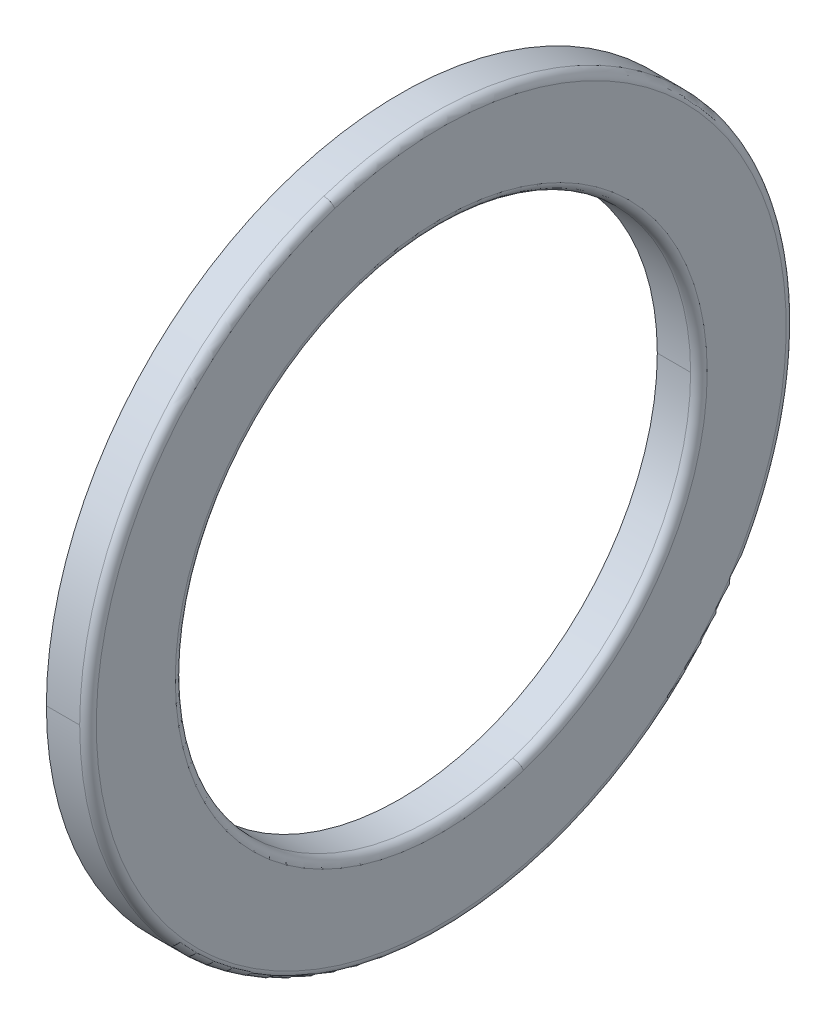
ISO-10303-21;
HEADER;
FILE_DESCRIPTION(('STEP AP214'),'2;1');
FILE_NAME('part.step','',(''),(''),'','','');
FILE_SCHEMA(('AUTOMOTIVE_DESIGN { 1 0 10303 214 1 1 1 1 }'));
ENDSEC;
DATA;
#1=APPLICATION_CONTEXT('core data for automotive mechanical design processes');
#2=APPLICATION_PROTOCOL_DEFINITION('international standard','automotive_design',2000,#1);
#3=PRODUCT_CONTEXT('',#1,'mechanical');
#4=PRODUCT('Part','Part','',(#3));
#5=PRODUCT_RELATED_PRODUCT_CATEGORY('part','',(#4));
#6=PRODUCT_DEFINITION_FORMATION('','',#4);
#7=PRODUCT_DEFINITION_CONTEXT('part definition',#1,'design');
#8=PRODUCT_DEFINITION('design','',#6,#7);
#9=PRODUCT_DEFINITION_SHAPE('','',#8);
#10=(LENGTH_UNIT() NAMED_UNIT(*) SI_UNIT(.MILLI.,.METRE.));
#11=(NAMED_UNIT(*) PLANE_ANGLE_UNIT() SI_UNIT($,.RADIAN.));
#12=(NAMED_UNIT(*) SI_UNIT($,.STERADIAN.) SOLID_ANGLE_UNIT());
#13=UNCERTAINTY_MEASURE_WITH_UNIT(LENGTH_MEASURE(1.E-05),#10,'distance_accuracy_value','');
#14=(GEOMETRIC_REPRESENTATION_CONTEXT(3) GLOBAL_UNCERTAINTY_ASSIGNED_CONTEXT((#13)) GLOBAL_UNIT_ASSIGNED_CONTEXT((#10,
#11,#12)) REPRESENTATION_CONTEXT('',''));
#15=CARTESIAN_POINT('',(0.,0.,0.));
#16=DIRECTION('',(0.,0.,1.));
#17=DIRECTION('',(1.,0.,0.));
#18=AXIS2_PLACEMENT_3D('',#15,#16,#17);
#19=CARTESIAN_POINT('',(8.5,0.,0.));
#20=DIRECTION('',(1.,0.,0.));
#21=DIRECTION('',(0.,-0.309016994374947,0.951056516295154));
#22=AXIS2_PLACEMENT_3D('',#19,#20,#21);
#23=TOROIDAL_SURFACE('',#22,36.25,4.3655);
#24=CARTESIAN_POINT('',(8.5,-34.4757987156993,-11.2018660460918));
#25=DIRECTION('',(0.,0.309016994374947,-0.951056516295154));
#26=DIRECTION('',(0.800000000000001,0.570633909777091,0.185410196624968));
#27=AXIS2_PLACEMENT_3D('',#24,#25,#26);
#28=CIRCLE('',#27,4.3655);
#29=CARTESIAN_POINT('',(11.9924,-31.9846963825674,-10.3924578327255));
#30=VERTEX_POINT('',#29);
#31=CARTESIAN_POINT('',(11.9924,-36.9669010488312,-12.0112742594581));
#32=VERTEX_POINT('',#31);
#33=EDGE_CURVE('E11',#30,#32,#28,.T.);
#34=ORIENTED_EDGE('',*,*,#33,.F.);
#35=CARTESIAN_POINT('',(11.9924,0.,0.));
#36=DIRECTION('',(1.,0.,0.));
#37=DIRECTION('',(0.,-0.951056516295154,-0.309016994374947));
#38=AXIS2_PLACEMENT_3D('',#35,#36,#37);
#39=CIRCLE('',#38,33.6307);
#40=CARTESIAN_POINT('',(11.9924,31.9846963825674,10.3924578327255));
#41=VERTEX_POINT('',#40);
#42=EDGE_CURVE('E25',#30,#41,#39,.T.);
#43=ORIENTED_EDGE('',*,*,#42,.T.);
#44=CARTESIAN_POINT('',(8.5,34.4757987156993,11.2018660460918));
#45=DIRECTION('',(0.,-0.309016994374947,0.951056516295154));
#46=DIRECTION('',(0.8,-0.570633909777093,-0.185410196624968));
#47=AXIS2_PLACEMENT_3D('',#44,#45,#46);
#48=CIRCLE('',#47,4.3655);
#49=CARTESIAN_POINT('',(11.9924,36.9669010488312,12.0112742594581));
#50=VERTEX_POINT('',#49);
#51=EDGE_CURVE('E327',#41,#50,#48,.T.);
#52=ORIENTED_EDGE('',*,*,#51,.T.);
#53=CARTESIAN_POINT('',(11.9924,0.,0.));
#54=DIRECTION('',(1.,0.,0.));
#55=DIRECTION('',(0.,-0.951056516295154,-0.309016994374947));
#56=AXIS2_PLACEMENT_3D('',#53,#54,#55);
#57=CIRCLE('',#56,38.8693);
#58=EDGE_CURVE('E323',#32,#50,#57,.T.);
#59=ORIENTED_EDGE('',*,*,#58,.F.);
#60=EDGE_LOOP('',(#34,#43,#52,#59));
#61=FACE_BOUND('',#60,.T.);
#62=ADVANCED_FACE('F17',(#61),#23,.F.);
#63=CARTESIAN_POINT('',(11.9924,42.5,0.));
#64=DIRECTION('',(-1.,0.,0.));
#65=DIRECTION('',(0.,0.,1.));
#66=AXIS2_PLACEMENT_3D('',#63,#64,#65);
#67=PLANE('',#66);
#68=ORIENTED_EDGE('',*,*,#58,.T.);
#69=CARTESIAN_POINT('',(11.9924,0.,0.));
#70=DIRECTION('',(1.,0.,0.));
#71=DIRECTION('',(0.,0.,-1.));
#72=AXIS2_PLACEMENT_3D('',#69,#70,#71);
#73=CIRCLE('',#72,38.8693);
#74=EDGE_CURVE('E318',#50,#32,#73,.T.);
#75=ORIENTED_EDGE('',*,*,#74,.T.);
#76=EDGE_LOOP('',(#68,#75));
#77=FACE_BOUND('',#76,.T.);
#78=CARTESIAN_POINT('',(11.9924,0.,0.));
#79=DIRECTION('',(1.,0.,0.));
#80=DIRECTION('',(0.,0.,-1.));
#81=AXIS2_PLACEMENT_3D('',#78,#79,#80);
#82=CIRCLE('',#81,42.5);
#83=CARTESIAN_POINT('',(11.9924,0.,42.5));
#84=VERTEX_POINT('',#83);
#85=CARTESIAN_POINT('',(11.9924,0.,-42.5));
#86=VERTEX_POINT('',#85);
#87=EDGE_CURVE('E313',#84,#86,#82,.T.);
#88=ORIENTED_EDGE('',*,*,#87,.F.);
#89=CARTESIAN_POINT('',(11.9924,0.,0.));
#90=DIRECTION('',(1.,0.,0.));
#91=DIRECTION('',(0.,0.,-1.));
#92=AXIS2_PLACEMENT_3D('',#89,#90,#91);
#93=CIRCLE('',#92,42.5);
#94=EDGE_CURVE('E308',#86,#84,#93,.T.);
#95=ORIENTED_EDGE('',*,*,#94,.F.);
#96=EDGE_LOOP('',(#88,#95));
#97=FACE_BOUND('',#96,.T.);
#98=ADVANCED_FACE('F233',(#77,#97),#67,.T.);
#99=CARTESIAN_POINT('',(16.,0.,0.));
#100=DIRECTION('',(1.,0.,0.));
#101=DIRECTION('',(0.,-1.,0.));
#102=AXIS2_PLACEMENT_3D('',#99,#100,#101);
#103=CYLINDRICAL_SURFACE('',#102,42.5);
#104=DIRECTION('',(1.,0.,0.));
#105=VECTOR('',#104,1.);
#106=CARTESIAN_POINT('',(11.9924,0.,42.5));
#107=LINE('',#106,#105);
#108=CARTESIAN_POINT('',(16.,0.,42.5));
#109=VERTEX_POINT('',#108);
#110=EDGE_CURVE('E304',#84,#109,#107,.T.);
#111=ORIENTED_EDGE('',*,*,#110,.T.);
#112=CARTESIAN_POINT('',(16.,0.,0.));
#113=DIRECTION('',(1.,0.,0.));
#114=DIRECTION('',(0.,0.,-1.));
#115=AXIS2_PLACEMENT_3D('',#112,#113,#114);
#116=CIRCLE('',#115,42.5);
#117=CARTESIAN_POINT('',(16.,40.419901942544,13.1332222609353));
#118=VERTEX_POINT('',#117);
#119=EDGE_CURVE('E300',#118,#109,#116,.T.);
#120=ORIENTED_EDGE('',*,*,#119,.F.);
#121=CARTESIAN_POINT('',(16.,0.,0.));
#122=DIRECTION('',(1.,0.,0.));
#123=DIRECTION('',(0.,0.,-1.));
#124=AXIS2_PLACEMENT_3D('',#121,#122,#123);
#125=CIRCLE('',#124,42.5);
#126=CARTESIAN_POINT('',(16.,0.,-42.5));
#127=VERTEX_POINT('',#126);
#128=EDGE_CURVE('E296',#127,#118,#125,.T.);
#129=ORIENTED_EDGE('',*,*,#128,.F.);
#130=DIRECTION('',(1.,0.,0.));
#131=VECTOR('',#130,1.);
#132=CARTESIAN_POINT('',(11.9924,0.,-42.5));
#133=LINE('',#132,#131);
#134=EDGE_CURVE('E291',#86,#127,#133,.T.);
#135=ORIENTED_EDGE('',*,*,#134,.F.);
#136=ORIENTED_EDGE('',*,*,#94,.T.);
#137=EDGE_LOOP('',(#111,#120,#129,#135,#136));
#138=FACE_BOUND('',#137,.T.);
#139=ADVANCED_FACE('F237',(#138),#103,.T.);
#140=CARTESIAN_POINT('',(16.,0.,0.));
#141=DIRECTION('',(1.,0.,0.));
#142=DIRECTION('',(0.,1.,0.));
#143=AXIS2_PLACEMENT_3D('',#140,#141,#142);
#144=CYLINDRICAL_SURFACE('',#143,42.5);
#145=ORIENTED_EDGE('',*,*,#110,.F.);
#146=ORIENTED_EDGE('',*,*,#87,.T.);
#147=ORIENTED_EDGE('',*,*,#134,.T.);
#148=CARTESIAN_POINT('',(16.,0.,0.));
#149=DIRECTION('',(1.,0.,0.));
#150=DIRECTION('',(0.,0.,-1.));
#151=AXIS2_PLACEMENT_3D('',#148,#149,#150);
#152=CIRCLE('',#151,42.5);
#153=CARTESIAN_POINT('',(16.,-40.419901942544,-13.1332222609353));
#154=VERTEX_POINT('',#153);
#155=EDGE_CURVE('E287',#154,#127,#152,.T.);
#156=ORIENTED_EDGE('',*,*,#155,.F.);
#157=CARTESIAN_POINT('',(16.,0.,0.));
#158=DIRECTION('',(1.,0.,0.));
#159=DIRECTION('',(0.,0.,-1.));
#160=AXIS2_PLACEMENT_3D('',#157,#158,#159);
#161=CIRCLE('',#160,42.5);
#162=EDGE_CURVE('E266',#109,#154,#161,.T.);
#163=ORIENTED_EDGE('',*,*,#162,.F.);
#164=EDGE_LOOP('',(#145,#146,#147,#156,#163));
#165=FACE_BOUND('',#164,.T.);
#166=ADVANCED_FACE('F242',(#165),#144,.T.);
#167=CARTESIAN_POINT('',(16.0000000000016,0.,0.));
#168=DIRECTION('',(1.,0.,0.));
#169=DIRECTION('',(0.,0.309016994374947,-0.951056516295154));
#170=AXIS2_PLACEMENT_3D('',#167,#168,#169);
#171=TOROIDAL_SURFACE('',#170,41.5000000000015,0.999999999998447);
#172=CARTESIAN_POINT('',(16.0000000000016,-39.4688454262503,-12.8242052665608));
#173=DIRECTION('',(0.,0.309016994374947,-0.951056516295154));
#174=DIRECTION('',(1.,0.,0.));
#175=AXIS2_PLACEMENT_3D('',#172,#173,#174);
#176=CIRCLE('',#175,0.999999999998447);
#177=CARTESIAN_POINT('',(17.,-39.4688454262503,-12.8242052665608));
#178=VERTEX_POINT('',#177);
#179=EDGE_CURVE('E259',#178,#154,#176,.T.);
#180=ORIENTED_EDGE('',*,*,#179,.F.);
#181=CARTESIAN_POINT('',(17.,0.,0.));
#182=DIRECTION('',(1.,0.,0.));
#183=DIRECTION('',(0.,0.,-1.));
#184=AXIS2_PLACEMENT_3D('',#181,#182,#183);
#185=CIRCLE('',#184,41.5);
#186=CARTESIAN_POINT('',(17.,39.4688454262503,12.8242052665608));
#187=VERTEX_POINT('',#186);
#188=EDGE_CURVE('E262',#187,#178,#185,.T.);
#189=ORIENTED_EDGE('',*,*,#188,.F.);
#190=CARTESIAN_POINT('',(16.0000000000016,39.4688454262503,12.8242052665608));
#191=DIRECTION('',(0.,-0.309016994374947,0.951056516295154));
#192=DIRECTION('',(1.,0.,0.));
#193=AXIS2_PLACEMENT_3D('',#190,#191,#192);
#194=CIRCLE('',#193,0.999999999998447);
#195=EDGE_CURVE('E271',#187,#118,#194,.T.);
#196=ORIENTED_EDGE('',*,*,#195,.T.);
#197=ORIENTED_EDGE('',*,*,#119,.T.);
#198=ORIENTED_EDGE('',*,*,#162,.T.);
#199=EDGE_LOOP('',(#180,#189,#196,#197,#198));
#200=FACE_BOUND('',#199,.T.);
#201=ADVANCED_FACE('F249',(#200),#171,.T.);
#202=CARTESIAN_POINT('',(16.0000000000016,0.,0.));
#203=DIRECTION('',(1.,0.,0.));
#204=DIRECTION('',(0.,-0.309016994374947,0.951056516295154));
#205=AXIS2_PLACEMENT_3D('',#202,#203,#204);
#206=TOROIDAL_SURFACE('',#205,41.5000000000015,0.999999999998447);
#207=ORIENTED_EDGE('',*,*,#179,.T.);
#208=ORIENTED_EDGE('',*,*,#155,.T.);
#209=ORIENTED_EDGE('',*,*,#128,.T.);
#210=ORIENTED_EDGE('',*,*,#195,.F.);
#211=CARTESIAN_POINT('',(17.,-39.4688454262489,-12.8242052665603));
#212=CARTESIAN_POINT('',(17.,-37.4543421555393,-19.0238989990822));
#213=CARTESIAN_POINT('',(17.,-34.2230332453021,-24.828421920391));
#214=CARTESIAN_POINT('',(17.,-29.8762607858964,-29.917564290866));
#215=CARTESIAN_POINT('',(17.,-19.4215831267624,-38.1169885356923));
#216=CARTESIAN_POINT('',(17.,-6.64299591734355,-41.7555416530186));
#217=CARTESIAN_POINT('',(17.,0.0292075835215191,-42.2806668346647));
#218=CARTESIAN_POINT('',(17.,13.2196452458229,-40.6858845403664));
#219=CARTESIAN_POINT('',(17.,24.8283229910739,-34.222945789598));
#220=CARTESIAN_POINT('',(17.,29.9175881758226,-29.8762877753694));
#221=CARTESIAN_POINT('',(17.,38.1169945302978,-19.4215713616868));
#222=CARTESIAN_POINT('',(17.,41.7555057788508,-6.64299245802185));
#223=CARTESIAN_POINT('',(17.,42.2807957370094,0.0291789531958564));
#224=CARTESIAN_POINT('',(17.,41.4831665897274,6.62445236381219));
#225=CARTESIAN_POINT('',(17.,39.4688454262489,12.8242052665603));
#226=B_SPLINE_CURVE_WITH_KNOTS('',5,(#211,#212,#213,#214,#215,#216,#217,#218,#219,#220,#221,
#222,#223,#224,#225),.UNSPECIFIED.,.F.,.F.,(6,3,3,3,6),(0.,0.785398163397448,1.5707963267949,
2.35619449019234,3.14159265358979),.UNSPECIFIED.);
#227=EDGE_CURVE('E205',#178,#187,#226,.T.);
#228=ORIENTED_EDGE('',*,*,#227,.F.);
#229=EDGE_LOOP('',(#207,#208,#209,#210,#228));
#230=FACE_BOUND('',#229,.T.);
#231=ADVANCED_FACE('F167',(#230),#206,.T.);
#232=CARTESIAN_POINT('',(17.,32.,0.));
#233=DIRECTION('',(1.,0.,0.));
#234=DIRECTION('',(0.,0.,-1.));
#235=AXIS2_PLACEMENT_3D('',#232,#233,#234);
#236=PLANE('',#235);
#237=ORIENTED_EDGE('',*,*,#227,.T.);
#238=ORIENTED_EDGE('',*,*,#188,.T.);
#239=EDGE_LOOP('',(#237,#238));
#240=FACE_BOUND('',#239,.T.);
#241=CARTESIAN_POINT('',(17.,30.4338085214434,9.8885438199979));
#242=CARTESIAN_POINT('',(17.,30.2720180013902,10.3865197825287));
#243=CARTESIAN_POINT('',(17.,30.0979849505985,10.8805169119714));
#244=CARTESIAN_POINT('',(17.,29.7258986864093,11.8593807699742));
#245=CARTESIAN_POINT('',(17.,29.5278454730118,12.3442474985344));
#246=CARTESIAN_POINT('',(17.,29.108183782482,13.3036778200655));
#247=CARTESIAN_POINT('',(17.,28.8865753053498,13.7782414130365));
#248=CARTESIAN_POINT('',(17.,28.420340238244,14.7159234436322));
#249=CARTESIAN_POINT('',(17.,28.1757136482706,15.1790418812568));
#250=CARTESIAN_POINT('',(17.,27.6640308043857,16.0927175745469));
#251=CARTESIAN_POINT('',(17.,27.3969745504742,16.5432748302124));
#252=CARTESIAN_POINT('',(17.,26.8410759758741,17.4307428171146));
#253=CARTESIAN_POINT('',(17.,26.5522336551854,17.8676535483512));
#254=CARTESIAN_POINT('',(17.,25.9534587304449,18.7267759062143));
#255=CARTESIAN_POINT('',(17.,25.643526126393,19.1489875328407));
#256=CARTESIAN_POINT('',(17.,25.0033173066067,19.9776945431137));
#257=CARTESIAN_POINT('',(17.,24.6730410908722,20.3841899267604));
#258=CARTESIAN_POINT('',(17.,23.9929407075273,21.1804851663695));
#259=CARTESIAN_POINT('',(17.,23.6431165399169,21.570285022332));
#260=CARTESIAN_POINT('',(17.,22.9247630110936,22.3322501450383));
#261=CARTESIAN_POINT('',(17.,22.5562336498806,22.7044154117822));
#262=CARTESIAN_POINT('',(17.,21.8013575530379,23.4302147772024));
#263=CARTESIAN_POINT('',(17.,21.415010817408,23.7838488758788));
#264=CARTESIAN_POINT('',(17.,20.6254307149445,24.4717339696786));
#265=CARTESIAN_POINT('',(17.,20.2221973481109,24.8059849648021));
#266=CARTESIAN_POINT('',(17.,19.3998154077164,25.4542986115632));
#267=CARTESIAN_POINT('',(17.,18.9806668341555,25.7683612632008));
#268=CARTESIAN_POINT('',(17.,18.1274642459395,26.3755416185561));
#269=CARTESIAN_POINT('',(17.,17.6934102312843,26.6686593222737));
#270=CARTESIAN_POINT('',(17.,16.811442435018,27.2332436355661));
#271=CARTESIAN_POINT('',(17.,16.3635286534068,27.5047102451408));
#272=CARTESIAN_POINT('',(17.,15.4549203867615,28.0253383833074));
#273=CARTESIAN_POINT('',(17.,14.9942259017273,28.2744999118992));
#274=CARTESIAN_POINT('',(17.,14.0611660816023,28.7499176361536));
#275=CARTESIAN_POINT('',(17.,13.5888007465114,28.9761738318162));
#276=CARTESIAN_POINT('',(17.,12.6335371957397,29.405235819219));
#277=CARTESIAN_POINT('',(17.,12.1506389800589,29.6080416109592));
#278=CARTESIAN_POINT('',(17.,11.1754730122055,29.9897142136014));
#279=CARTESIAN_POINT('',(17.,10.6832052600331,30.1685810245033));
#280=CARTESIAN_POINT('',(17.,9.69048613532908,30.5019447596545));
#281=CARTESIAN_POINT('',(17.,9.19003476279757,30.6564416839037));
#282=CARTESIAN_POINT('',(17.,8.18215402856629,30.9406934491267));
#283=CARTESIAN_POINT('',(17.,7.67472466686652,31.0704482901005));
#284=CARTESIAN_POINT('',(17.,6.65411039607662,31.3049032979954));
#285=CARTESIAN_POINT('',(17.,6.14092548698649,31.4096034649165));
#286=CARTESIAN_POINT('',(17.,5.11003642881157,31.5936968928335));
#287=CARTESIAN_POINT('',(17.,4.59233227972677,31.6730901538293));
#288=CARTESIAN_POINT('',(17.,3.55365193620319,31.8063785045757));
#289=CARTESIAN_POINT('',(17.,3.0326757417644,31.8602735943264));
#290=CARTESIAN_POINT('',(17.,1.98870638481736,31.9424357645907));
#291=CARTESIAN_POINT('',(17.,1.4657132223091,31.9707028451044));
#292=CARTESIAN_POINT('',(17.,0.418969865560389,32.0015408990219));
#293=CARTESIAN_POINT('',(17.,-0.104780328680064,32.0041118724257));
#294=CARTESIAN_POINT('',(17.,-1.15177598880014,31.9835515184234));
#295=CARTESIAN_POINT('',(17.,-1.67502145467976,31.9604201910172));
#296=CARTESIAN_POINT('',(17.,-2.71974711391999,31.8885109607887));
#297=CARTESIAN_POINT('',(17.,-3.24122730728059,31.8397330579664));
#298=CARTESIAN_POINT('',(17.,-4.28116613002069,31.7166481871458));
#299=CARTESIAN_POINT('',(17.,-4.79962475940019,31.6423412191477));
#300=CARTESIAN_POINT('',(17.,-5.83227144192831,31.4683772299699));
#301=CARTESIAN_POINT('',(17.,-6.34645949507693,31.3687202087902));
#302=CARTESIAN_POINT('',(17.,-7.36932630108569,31.1442961957426));
#303=CARTESIAN_POINT('',(17.,-7.87800505394583,31.0195292038745));
#304=CARTESIAN_POINT('',(17.,-8.888627807707,30.7451858240616));
#305=CARTESIAN_POINT('',(17.,-9.39057180860802,30.5956094361167));
#306=CARTESIAN_POINT('',(17.,-10.3865158313877,30.2720076067702));
#307=CARTESIAN_POINT('',(17.,-10.8805158532663,30.0979821653685));
#308=CARTESIAN_POINT('',(17.,-11.8593818286792,29.7259014716394));
#309=CARTESIAN_POINT('',(17.,-12.3442477822135,29.527846219312));
#310=CARTESIAN_POINT('',(17.,-13.3036775363863,29.1081830361819));
#311=CARTESIAN_POINT('',(17.,-13.7782413370249,28.8865751053793));
#312=CARTESIAN_POINT('',(17.,-14.7159235196437,28.4203404382146));
#313=CARTESIAN_POINT('',(17.,-15.179041901624,28.1757137018525));
#314=CARTESIAN_POINT('',(17.,-16.0927175541796,27.6640307508038));
#315=CARTESIAN_POINT('',(17.,-16.543274824755,27.396974536117));
#316=CARTESIAN_POINT('',(17.,-17.4307428225719,26.8410759902314));
#317=CARTESIAN_POINT('',(17.,-17.8676535498135,26.5522336590324));
#318=CARTESIAN_POINT('',(17.,-18.7267759047519,25.9534587265979));
#319=CARTESIAN_POINT('',(17.,-19.1489875324489,25.6435261253623));
#320=CARTESIAN_POINT('',(17.,-19.9776945435055,25.0033173076375));
#321=CARTESIAN_POINT('',(17.,-20.3841899268653,24.6730410911485));
#322=CARTESIAN_POINT('',(17.,-21.1804851662644,23.9929407072512));
#323=CARTESIAN_POINT('',(17.,-21.5702850223038,23.6431165398429));
#324=CARTESIAN_POINT('',(17.,-22.3322501450664,22.9247630111676));
#325=CARTESIAN_POINT('',(17.,-22.7044154117897,22.5562336499005));
#326=CARTESIAN_POINT('',(17.,-23.4302147771949,21.8013575530181));
#327=CARTESIAN_POINT('',(17.,-23.7838488758767,21.4150108174027));
#328=CARTESIAN_POINT('',(17.,-24.4717339696806,20.6254307149499));
#329=CARTESIAN_POINT('',(17.,-24.8059849648026,20.2221973481124));
#330=CARTESIAN_POINT('',(17.,-25.4542986115626,19.3998154077151));
#331=CARTESIAN_POINT('',(17.,-25.7683612632006,18.9806668341552));
#332=CARTESIAN_POINT('',(17.,-26.3755416185562,18.1274642459399));
#333=CARTESIAN_POINT('',(17.,-26.6686593222737,17.6934102312844));
#334=CARTESIAN_POINT('',(17.,-27.233243635566,16.8114424350179));
#335=CARTESIAN_POINT('',(17.,-27.5047102451408,16.3635286534068));
#336=CARTESIAN_POINT('',(17.,-28.0253383833074,15.4549203867615));
#337=CARTESIAN_POINT('',(17.,-28.2744999118992,14.9942259017273));
#338=CARTESIAN_POINT('',(17.,-28.7499176361536,14.0611660816023));
#339=CARTESIAN_POINT('',(17.,-28.9761738318161,13.5888007465115));
#340=CARTESIAN_POINT('',(17.,-29.405235819219,12.6335371957398));
#341=CARTESIAN_POINT('',(17.,-29.6080416109593,12.1506389800589));
#342=CARTESIAN_POINT('',(17.,-29.9897142136012,11.1754730122056));
#343=CARTESIAN_POINT('',(17.,-30.1685810245029,10.6832052600332));
#344=CARTESIAN_POINT('',(17.,-30.5019447596548,9.69048613532902));
#345=CARTESIAN_POINT('',(17.,-30.6564416839052,9.19003476279721));
#346=CARTESIAN_POINT('',(17.,-30.9406934491253,8.18215402856672));
#347=CARTESIAN_POINT('',(17.,-31.070448290095,7.67472466686804));
#348=CARTESIAN_POINT('',(17.,-31.3049032980009,6.65411039607517));
#349=CARTESIAN_POINT('',(17.,-31.409603464937,6.14092548698098));
#350=CARTESIAN_POINT('',(17.,-31.593696892813,5.11003642881718));
#351=CARTESIAN_POINT('',(17.,-31.6730901537529,4.59233227974757));
#352=CARTESIAN_POINT('',(17.,-31.8063785046521,3.55365193618251));
#353=CARTESIAN_POINT('',(17.,-31.8602735946116,3.03267574168705));
#354=CARTESIAN_POINT('',(17.,-31.9424357643056,1.98870638489482));
#355=CARTESIAN_POINT('',(17.,-31.9707028440401,1.46571322259806));
#356=CARTESIAN_POINT('',(17.,-32.0015409000861,0.418969865271547));
#357=CARTESIAN_POINT('',(17.,-32.0041118763975,-0.104780329758194));
#358=CARTESIAN_POINT('',(17.,-31.9835515144516,-1.15177598772189));
#359=CARTESIAN_POINT('',(17.,-31.9604201761942,-1.67502145065585));
#360=CARTESIAN_POINT('',(17.,-31.8885109756117,-2.71974711794379));
#361=CARTESIAN_POINT('',(17.,-31.8397331132866,-3.24122732229777));
#362=CARTESIAN_POINT('',(17.,-31.7166481318256,-4.28116611500344));
#363=CARTESIAN_POINT('',(17.,-31.6423410126896,-4.79962470335512));
#364=CARTESIAN_POINT('',(17.,-31.4683774364279,-5.83227149797332));
#365=CARTESIAN_POINT('',(17.,-31.3687209793022,-6.34645970423985));
#366=CARTESIAN_POINT('',(17.,-31.1442954252306,-7.36932609192269));
#367=CARTESIAN_POINT('',(17.,-31.0195263282849,-7.878004273339));
#368=CARTESIAN_POINT('',(17.,-30.7451886996512,-8.88862858831373));
#369=CARTESIAN_POINT('',(17.,-30.5956201679634,-9.39057472187216));
#370=CARTESIAN_POINT('',(17.,-30.4338085214435,-9.88854381999781));
#371=B_SPLINE_CURVE_WITH_KNOTS('',3,(#241,#242,#243,#244,#245,#246,#247,#248,#249,#250,#251,
#252,#253,#254,#255,#256,#257,#258,#259,#260,#261,#262,#263,#264,#265,#266,#267,#268,#269,#270,
#271,#272,#273,#274,#275,#276,#277,#278,#279,#280,#281,#282,#283,#284,#285,#286,#287,#288,#289,
#290,#291,#292,#293,#294,#295,#296,#297,#298,#299,#300,#301,#302,#303,#304,#305,#306,#307,#308,
#309,#310,#311,#312,#313,#314,#315,#316,#317,#318,#319,#320,#321,#322,#323,#324,#325,#326,#327,
#328,#329,#330,#331,#332,#333,#334,#335,#336,#337,#338,#339,#340,#341,#342,#343,#344,#345,#346,
#347,#348,#349,#350,#351,#352,#353,#354,#355,#356,#357,#358,#359,#360,#361,#362,#363,#364,#365,
#366,#367,#368,#369,#370),.UNSPECIFIED.,.F.,.F.,(4,2,2,2,2,2,2,2,2,2,2,2,2,2,2,2,2,2,2,2,2,2,2,
2,2,2,2,2,2,2,2,2,2,2,2,2,2,2,2,2,2,2,2,2,2,2,2,2,2,2,2,2,2,2,2,2,2,2,2,2,2,2,2,2,4),(0.,
1.5706386254663,3.14127725093262,4.71191587639892,6.28255450186523,7.85319312733154,
9.42383175279786,10.9944703782642,12.5651090037305,14.1357476291968,15.7063862546631,
17.2770248801294,18.8476635055957,20.418302131062,21.9889407565283,23.5595793819946,
25.1302180074609,26.7008566329273,28.2714952583936,29.8421338838599,31.4127725093262,
32.9834111347925,34.5540497602588,36.1246883857251,37.6953270111914,39.2659656366577,
40.836604262124,42.4072428875903,43.9778815130566,45.5485201385229,47.1191587639893,
48.6897973894556,50.2604360149219,51.8310746403882,53.4017132658545,54.9723518913208,
56.5429905167871,58.1136291422534,59.6842677677197,61.254906393186,62.8255450186523,
64.3961836441186,65.966822269585,67.5374608950513,69.1080995205176,70.6787381459839,
72.2493767714502,73.8200153969165,75.3906540223828,76.9612926478491,78.5319312733154,
80.1025698987817,81.673208524248,83.2438471497143,84.8144857751806,86.3851244006469,
87.9557630261132,89.5264016515795,91.0970402770458,92.6676789025122,94.2383175279785,
95.8089561534448,97.3795947789111,98.9502334043774,100.520872029844),.UNSPECIFIED.);
#372=CARTESIAN_POINT('',(17.,30.4338085214434,9.88854381999784));
#373=VERTEX_POINT('',#372);
#374=CARTESIAN_POINT('',(17.,-30.4338085214434,-9.88854381999783));
#375=VERTEX_POINT('',#374);
#376=EDGE_CURVE('E201',#373,#375,#371,.T.);
#377=ORIENTED_EDGE('',*,*,#376,.F.);
#378=CARTESIAN_POINT('',(17.,-30.4338085214434,-9.88854381999789));
#379=CARTESIAN_POINT('',(17.,-30.2720180013902,-10.3865197825287));
#380=CARTESIAN_POINT('',(17.,-30.0979849505985,-10.8805169119714));
#381=CARTESIAN_POINT('',(17.,-29.7258986864093,-11.8593807699742));
#382=CARTESIAN_POINT('',(17.,-29.5278454730118,-12.3442474985344));
#383=CARTESIAN_POINT('',(17.,-29.108183782482,-13.3036778200655));
#384=CARTESIAN_POINT('',(17.,-28.8865753053498,-13.7782414130365));
#385=CARTESIAN_POINT('',(17.,-28.420340238244,-14.7159234436321));
#386=CARTESIAN_POINT('',(17.,-28.1757136482706,-15.1790418812568));
#387=CARTESIAN_POINT('',(17.,-27.6640308043857,-16.0927175745469));
#388=CARTESIAN_POINT('',(17.,-27.3969745504742,-16.5432748302124));
#389=CARTESIAN_POINT('',(17.,-26.8410759758741,-17.4307428171146));
#390=CARTESIAN_POINT('',(17.,-26.5522336551854,-17.8676535483512));
#391=CARTESIAN_POINT('',(17.,-25.9534587304449,-18.7267759062143));
#392=CARTESIAN_POINT('',(17.,-25.643526126393,-19.1489875328407));
#393=CARTESIAN_POINT('',(17.,-25.0033173066067,-19.9776945431137));
#394=CARTESIAN_POINT('',(17.,-24.6730410908722,-20.3841899267603));
#395=CARTESIAN_POINT('',(17.,-23.9929407075273,-21.1804851663695));
#396=CARTESIAN_POINT('',(17.,-23.6431165399169,-21.5702850223319));
#397=CARTESIAN_POINT('',(17.,-22.9247630110936,-22.3322501450383));
#398=CARTESIAN_POINT('',(17.,-22.5562336498806,-22.7044154117822));
#399=CARTESIAN_POINT('',(17.,-21.8013575530379,-23.4302147772024));
#400=CARTESIAN_POINT('',(17.,-21.415010817408,-23.7838488758787));
#401=CARTESIAN_POINT('',(17.,-20.6254307149446,-24.4717339696786));
#402=CARTESIAN_POINT('',(17.,-20.222197348111,-24.8059849648021));
#403=CARTESIAN_POINT('',(17.,-19.3998154077165,-25.4542986115632));
#404=CARTESIAN_POINT('',(17.,-18.9806668341556,-25.7683612632008));
#405=CARTESIAN_POINT('',(17.,-18.1274642459395,-26.375541618556));
#406=CARTESIAN_POINT('',(17.,-17.6934102312843,-26.6686593222737));
#407=CARTESIAN_POINT('',(17.,-16.811442435018,-27.2332436355661));
#408=CARTESIAN_POINT('',(17.,-16.3635286534068,-27.5047102451408));
#409=CARTESIAN_POINT('',(17.,-15.4549203867615,-28.0253383833074));
#410=CARTESIAN_POINT('',(17.,-14.9942259017273,-28.2744999118992));
#411=CARTESIAN_POINT('',(17.,-14.0611660816023,-28.7499176361536));
#412=CARTESIAN_POINT('',(17.,-13.5888007465114,-28.9761738318162));
#413=CARTESIAN_POINT('',(17.,-12.6335371957398,-29.405235819219));
#414=CARTESIAN_POINT('',(17.,-12.1506389800589,-29.6080416109592));
#415=CARTESIAN_POINT('',(17.,-11.1754730122055,-29.9897142136014));
#416=CARTESIAN_POINT('',(17.,-10.6832052600331,-30.1685810245033));
#417=CARTESIAN_POINT('',(17.,-9.69048613532911,-30.5019447596545));
#418=CARTESIAN_POINT('',(17.,-9.1900347627976,-30.6564416839037));
#419=CARTESIAN_POINT('',(17.,-8.18215402856632,-30.9406934491267));
#420=CARTESIAN_POINT('',(17.,-7.67472466686655,-31.0704482901005));
#421=CARTESIAN_POINT('',(17.,-6.65411039607666,-31.3049032979954));
#422=CARTESIAN_POINT('',(17.,-6.14092548698654,-31.4096034649165));
#423=CARTESIAN_POINT('',(17.,-5.11003642881163,-31.5936968928335));
#424=CARTESIAN_POINT('',(17.,-4.59233227972683,-31.6730901538293));
#425=CARTESIAN_POINT('',(17.,-3.55365193620325,-31.8063785045757));
#426=CARTESIAN_POINT('',(17.,-3.03267574176445,-31.8602735943264));
#427=CARTESIAN_POINT('',(17.,-1.9887063848174,-31.9424357645907));
#428=CARTESIAN_POINT('',(17.,-1.46571322230914,-31.9707028451044));
#429=CARTESIAN_POINT('',(17.,-0.418969865560424,-32.0015408990219));
#430=CARTESIAN_POINT('',(17.,0.104780328680024,-32.0041118724257));
#431=CARTESIAN_POINT('',(17.,1.1517759888001,-31.9835515184234));
#432=CARTESIAN_POINT('',(17.,1.67502145467973,-31.9604201910172));
#433=CARTESIAN_POINT('',(17.,2.71974711391995,-31.8885109607887));
#434=CARTESIAN_POINT('',(17.,3.24122730728055,-31.8397330579664));
#435=CARTESIAN_POINT('',(17.,4.28116613002064,-31.7166481871459));
#436=CARTESIAN_POINT('',(17.,4.79962475940015,-31.6423412191477));
#437=CARTESIAN_POINT('',(17.,5.83227144192827,-31.4683772299699));
#438=CARTESIAN_POINT('',(17.,6.34645949507689,-31.3687202087903));
#439=CARTESIAN_POINT('',(17.,7.36932630108564,-31.1442961957426));
#440=CARTESIAN_POINT('',(17.,7.87800505394578,-31.0195292038745));
#441=CARTESIAN_POINT('',(17.,8.88862780770695,-30.7451858240616));
#442=CARTESIAN_POINT('',(17.,9.39057180860797,-30.5956094361167));
#443=CARTESIAN_POINT('',(17.,10.3865158313876,-30.2720076067702));
#444=CARTESIAN_POINT('',(17.,10.8805158532663,-30.0979821653685));
#445=CARTESIAN_POINT('',(17.,11.8593818286792,-29.7259014716394));
#446=CARTESIAN_POINT('',(17.,12.3442477822134,-29.527846219312));
#447=CARTESIAN_POINT('',(17.,13.3036775363863,-29.1081830361819));
#448=CARTESIAN_POINT('',(17.,13.7782413370248,-28.8865751053793));
#449=CARTESIAN_POINT('',(17.,14.7159235196437,-28.4203404382146));
#450=CARTESIAN_POINT('',(17.,15.1790419016239,-28.1757137018526));
#451=CARTESIAN_POINT('',(17.,16.0927175541796,-27.6640307508038));
#452=CARTESIAN_POINT('',(17.,16.543274824755,-27.396974536117));
#453=CARTESIAN_POINT('',(17.,17.4307428225719,-26.8410759902314));
#454=CARTESIAN_POINT('',(17.,17.8676535498135,-26.5522336590325));
#455=CARTESIAN_POINT('',(17.,18.7267759047519,-25.9534587265979));
#456=CARTESIAN_POINT('',(17.,19.1489875324488,-25.6435261253623));
#457=CARTESIAN_POINT('',(17.,19.9776945435055,-25.0033173076376));
#458=CARTESIAN_POINT('',(17.,20.3841899268653,-24.6730410911485));
#459=CARTESIAN_POINT('',(17.,21.1804851662644,-23.9929407072512));
#460=CARTESIAN_POINT('',(17.,21.5702850223037,-23.643116539843));
#461=CARTESIAN_POINT('',(17.,22.3322501450664,-22.9247630111676));
#462=CARTESIAN_POINT('',(17.,22.7044154117897,-22.5562336499005));
#463=CARTESIAN_POINT('',(17.,23.4302147771948,-21.8013575530181));
#464=CARTESIAN_POINT('',(17.,23.7838488758767,-21.4150108174028));
#465=CARTESIAN_POINT('',(17.,24.4717339696805,-20.6254307149499));
#466=CARTESIAN_POINT('',(17.,24.8059849648026,-20.2221973481125));
#467=CARTESIAN_POINT('',(17.,25.4542986115626,-19.3998154077151));
#468=CARTESIAN_POINT('',(17.,25.7683612632006,-18.9806668341553));
#469=CARTESIAN_POINT('',(17.,26.3755416185561,-18.12746424594));
#470=CARTESIAN_POINT('',(17.,26.6686593222737,-17.6934102312845));
#471=CARTESIAN_POINT('',(17.,27.233243635566,-16.811442435018));
#472=CARTESIAN_POINT('',(17.,27.5047102451407,-16.3635286534069));
#473=CARTESIAN_POINT('',(17.,28.0253383833073,-15.4549203867616));
#474=CARTESIAN_POINT('',(17.,28.2744999118992,-14.9942259017274));
#475=CARTESIAN_POINT('',(17.,28.7499176361535,-14.0611660816024));
#476=CARTESIAN_POINT('',(17.,28.9761738318161,-13.5888007465115));
#477=CARTESIAN_POINT('',(17.,29.405235819219,-12.6335371957398));
#478=CARTESIAN_POINT('',(17.,29.6080416109593,-12.1506389800589));
#479=CARTESIAN_POINT('',(17.,29.9897142136012,-11.1754730122057));
#480=CARTESIAN_POINT('',(17.,30.1685810245029,-10.6832052600333));
#481=CARTESIAN_POINT('',(17.,30.5019447596548,-9.69048613532908));
#482=CARTESIAN_POINT('',(17.,30.6564416839052,-9.19003476279728));
#483=CARTESIAN_POINT('',(17.,30.9406934491252,-8.1821540285668));
#484=CARTESIAN_POINT('',(17.,31.070448290095,-7.67472466686813));
#485=CARTESIAN_POINT('',(17.,31.3049032980008,-6.65411039607526));
#486=CARTESIAN_POINT('',(17.,31.409603464937,-6.14092548698107));
#487=CARTESIAN_POINT('',(17.,31.593696892813,-5.11003642881727));
#488=CARTESIAN_POINT('',(17.,31.6730901537529,-4.59233227974766));
#489=CARTESIAN_POINT('',(17.,31.8063785046521,-3.5536519361826));
#490=CARTESIAN_POINT('',(17.,31.8602735946115,-3.03267574168714));
#491=CARTESIAN_POINT('',(17.,31.9424357643055,-1.98870638489491));
#492=CARTESIAN_POINT('',(17.,31.9707028440401,-1.46571322259814));
#493=CARTESIAN_POINT('',(17.,32.0015409000861,-0.418969865271636));
#494=CARTESIAN_POINT('',(17.,32.0041118763975,0.104780329758105));
#495=CARTESIAN_POINT('',(17.,31.9835515144515,1.1517759877218));
#496=CARTESIAN_POINT('',(17.,31.9604201761942,1.67502145065576));
#497=CARTESIAN_POINT('',(17.,31.8885109756117,2.7197471179437));
#498=CARTESIAN_POINT('',(17.,31.8397331132867,3.24122732229769));
#499=CARTESIAN_POINT('',(17.,31.7166481318256,4.28116611500335));
#500=CARTESIAN_POINT('',(17.,31.6423410126896,4.79962470335503));
#501=CARTESIAN_POINT('',(17.,31.4683774364279,5.83227149797324));
#502=CARTESIAN_POINT('',(17.,31.3687209793022,6.34645970423976));
#503=CARTESIAN_POINT('',(17.,31.1442954252307,7.3693260919226));
#504=CARTESIAN_POINT('',(17.,31.0195263282849,7.87800427333891));
#505=CARTESIAN_POINT('',(17.,30.7451886996512,8.88862858831365));
#506=CARTESIAN_POINT('',(17.,30.5956201679634,9.39057472187207));
#507=CARTESIAN_POINT('',(17.,30.4338085214435,9.88854381999772));
#508=B_SPLINE_CURVE_WITH_KNOTS('',3,(#378,#379,#380,#381,#382,#383,#384,#385,#386,#387,#388,
#389,#390,#391,#392,#393,#394,#395,#396,#397,#398,#399,#400,#401,#402,#403,#404,#405,#406,#407,
#408,#409,#410,#411,#412,#413,#414,#415,#416,#417,#418,#419,#420,#421,#422,#423,#424,#425,#426,
#427,#428,#429,#430,#431,#432,#433,#434,#435,#436,#437,#438,#439,#440,#441,#442,#443,#444,#445,
#446,#447,#448,#449,#450,#451,#452,#453,#454,#455,#456,#457,#458,#459,#460,#461,#462,#463,#464,
#465,#466,#467,#468,#469,#470,#471,#472,#473,#474,#475,#476,#477,#478,#479,#480,#481,#482,#483,
#484,#485,#486,#487,#488,#489,#490,#491,#492,#493,#494,#495,#496,#497,#498,#499,#500,#501,#502,
#503,#504,#505,#506,#507),.UNSPECIFIED.,.F.,.F.,(4,2,2,2,2,2,2,2,2,2,2,2,2,2,2,2,2,2,2,2,2,2,2,
2,2,2,2,2,2,2,2,2,2,2,2,2,2,2,2,2,2,2,2,2,2,2,2,2,2,2,2,2,2,2,2,2,2,2,2,2,2,2,2,2,4),(0.,
1.5706386254663,3.14127725093262,4.71191587639892,6.28255450186523,7.85319312733153,
9.42383175279784,10.9944703782641,12.5651090037305,14.1357476291968,15.7063862546631,
17.2770248801294,18.8476635055957,20.418302131062,21.9889407565283,23.5595793819946,
25.1302180074609,26.7008566329272,28.2714952583935,29.8421338838599,31.4127725093262,
32.9834111347925,34.5540497602588,36.1246883857251,37.6953270111914,39.2659656366577,
40.836604262124,42.4072428875903,43.9778815130566,45.5485201385229,47.1191587639892,
48.6897973894555,50.2604360149218,51.8310746403881,53.4017132658545,54.9723518913208,
56.5429905167871,58.1136291422534,59.6842677677197,61.254906393186,62.8255450186523,
64.3961836441186,65.9668222695849,67.5374608950512,69.1080995205175,70.6787381459838,
72.2493767714501,73.8200153969164,75.3906540223827,76.961292647849,78.5319312733154,
80.1025698987817,81.673208524248,83.2438471497143,84.8144857751806,86.3851244006469,
87.9557630261132,89.5264016515795,91.0970402770458,92.6676789025121,94.2383175279784,
95.8089561534447,97.379594778911,98.9502334043773,100.520872029844),.UNSPECIFIED.);
#509=EDGE_CURVE('E191',#375,#373,#508,.T.);
#510=ORIENTED_EDGE('',*,*,#509,.F.);
#511=EDGE_LOOP('',(#377,#510));
#512=FACE_BOUND('',#511,.T.);
#513=ADVANCED_FACE('F161',(#240,#512),#236,.T.);
#514=CARTESIAN_POINT('',(16.0000000000016,0.,0.));
#515=DIRECTION('',(1.,0.,0.));
#516=DIRECTION('',(0.,-0.309016994374947,0.951056516295154));
#517=AXIS2_PLACEMENT_3D('',#514,#515,#516);
#518=TOROIDAL_SURFACE('',#517,31.9999999999985,0.99999999999846);
#519=CARTESIAN_POINT('',(16.0000000000016,-30.4338085214434,-9.88854381999783));
#520=DIRECTION('',(0.,0.309016994374948,-0.951056516295154));
#521=DIRECTION('',(-1.55253587763821E-12,0.951056516295154,0.309016994374948));
#522=AXIS2_PLACEMENT_3D('',#519,#520,#521);
#523=CIRCLE('',#522,0.999999999998461);
#524=CARTESIAN_POINT('',(16.,-29.4827520051498,-9.57952682562336));
#525=VERTEX_POINT('',#524);
#526=EDGE_CURVE('E142',#525,#375,#523,.T.);
#527=ORIENTED_EDGE('',*,*,#526,.T.);
#528=ORIENTED_EDGE('',*,*,#509,.T.);
#529=CARTESIAN_POINT('',(16.0000000000016,30.4338085214434,9.88854381999784));
#530=DIRECTION('',(0.,-0.309016994374948,0.951056516295154));
#531=DIRECTION('',(-1.55253587763821E-12,-0.951056516295154,-0.309016994374948));
#532=AXIS2_PLACEMENT_3D('',#529,#530,#531);
#533=CIRCLE('',#532,0.999999999998461);
#534=CARTESIAN_POINT('',(16.,29.4827520051498,9.57952682562336));
#535=VERTEX_POINT('',#534);
#536=EDGE_CURVE('E137',#535,#373,#533,.T.);
#537=ORIENTED_EDGE('',*,*,#536,.F.);
#538=CARTESIAN_POINT('',(16.,0.,0.));
#539=DIRECTION('',(1.,0.,0.));
#540=DIRECTION('',(0.,0.,-1.));
#541=AXIS2_PLACEMENT_3D('',#538,#539,#540);
#542=CIRCLE('',#541,31.);
#543=CARTESIAN_POINT('',(16.,0.,-31.));
#544=VERTEX_POINT('',#543);
#545=EDGE_CURVE('E133',#544,#535,#542,.T.);
#546=ORIENTED_EDGE('',*,*,#545,.F.);
#547=CARTESIAN_POINT('',(16.,0.,0.));
#548=DIRECTION('',(1.,0.,0.));
#549=DIRECTION('',(0.,0.,-1.));
#550=AXIS2_PLACEMENT_3D('',#547,#548,#549);
#551=CIRCLE('',#550,31.);
#552=EDGE_CURVE('E109',#525,#544,#551,.T.);
#553=ORIENTED_EDGE('',*,*,#552,.F.);
#554=EDGE_LOOP('',(#527,#528,#537,#546,#553));
#555=FACE_BOUND('',#554,.T.);
#556=ADVANCED_FACE('F151',(#555),#518,.T.);
#557=CARTESIAN_POINT('',(16.,0.,0.));
#558=DIRECTION('',(1.,0.,0.));
#559=DIRECTION('',(0.,1.,0.));
#560=AXIS2_PLACEMENT_3D('',#557,#558,#559);
#561=CYLINDRICAL_SURFACE('',#560,31.);
#562=DIRECTION('',(1.,0.,0.));
#563=VECTOR('',#562,1.);
#564=CARTESIAN_POINT('',(11.9924,0.,31.));
#565=LINE('',#564,#563);
#566=CARTESIAN_POINT('',(11.9924,0.,31.));
#567=VERTEX_POINT('',#566);
#568=CARTESIAN_POINT('',(16.,0.,31.));
#569=VERTEX_POINT('',#568);
#570=EDGE_CURVE('E93',#567,#569,#565,.T.);
#571=ORIENTED_EDGE('',*,*,#570,.T.);
#572=CARTESIAN_POINT('',(16.,0.,0.));
#573=DIRECTION('',(1.,0.,0.));
#574=DIRECTION('',(0.,0.,-1.));
#575=AXIS2_PLACEMENT_3D('',#572,#573,#574);
#576=CIRCLE('',#575,31.);
#577=EDGE_CURVE('E110',#569,#525,#576,.T.);
#578=ORIENTED_EDGE('',*,*,#577,.T.);
#579=ORIENTED_EDGE('',*,*,#552,.T.);
#580=DIRECTION('',(1.,0.,0.));
#581=VECTOR('',#580,1.);
#582=CARTESIAN_POINT('',(11.9924,0.,-31.));
#583=LINE('',#582,#581);
#584=CARTESIAN_POINT('',(11.9924,0.,-31.));
#585=VERTEX_POINT('',#584);
#586=EDGE_CURVE('E97',#585,#544,#583,.T.);
#587=ORIENTED_EDGE('',*,*,#586,.F.);
#588=CARTESIAN_POINT('',(11.9924,0.,0.));
#589=DIRECTION('',(1.,0.,0.));
#590=DIRECTION('',(0.,0.,-1.));
#591=AXIS2_PLACEMENT_3D('',#588,#589,#590);
#592=CIRCLE('',#591,31.);
#593=EDGE_CURVE('E89',#567,#585,#592,.T.);
#594=ORIENTED_EDGE('',*,*,#593,.F.);
#595=EDGE_LOOP('',(#571,#578,#579,#587,#594));
#596=FACE_BOUND('',#595,.T.);
#597=ADVANCED_FACE('F91',(#596),#561,.F.);
#598=CARTESIAN_POINT('',(11.9924,33.6307,0.));
#599=DIRECTION('',(-1.,0.,0.));
#600=DIRECTION('',(0.,0.,1.));
#601=AXIS2_PLACEMENT_3D('',#598,#599,#600);
#602=PLANE('',#601);
#603=CARTESIAN_POINT('',(11.9924,0.,0.));
#604=DIRECTION('',(1.,0.,0.));
#605=DIRECTION('',(0.,0.,-1.));
#606=AXIS2_PLACEMENT_3D('',#603,#604,#605);
#607=CIRCLE('',#606,31.);
#608=EDGE_CURVE('E101',#585,#567,#607,.T.);
#609=ORIENTED_EDGE('',*,*,#608,.T.);
#610=ORIENTED_EDGE('',*,*,#593,.T.);
#611=EDGE_LOOP('',(#609,#610));
#612=FACE_BOUND('',#611,.T.);
#613=ORIENTED_EDGE('',*,*,#42,.F.);
#614=CARTESIAN_POINT('',(11.9924,0.,0.));
#615=DIRECTION('',(1.,0.,0.));
#616=DIRECTION('',(0.,0.,-1.));
#617=AXIS2_PLACEMENT_3D('',#614,#615,#616);
#618=CIRCLE('',#617,33.6307);
#619=EDGE_CURVE('E114',#41,#30,#618,.T.);
#620=ORIENTED_EDGE('',*,*,#619,.F.);
#621=EDGE_LOOP('',(#613,#620));
#622=FACE_BOUND('',#621,.T.);
#623=ADVANCED_FACE('F112',(#612,#622),#602,.T.);
#624=CARTESIAN_POINT('',(8.5,0.,0.));
#625=DIRECTION('',(1.,0.,0.));
#626=DIRECTION('',(0.,0.309016994374947,-0.951056516295154));
#627=AXIS2_PLACEMENT_3D('',#624,#625,#626);
#628=TOROIDAL_SURFACE('',#627,36.25,4.3655);
#629=ORIENTED_EDGE('',*,*,#33,.T.);
#630=ORIENTED_EDGE('',*,*,#74,.F.);
#631=ORIENTED_EDGE('',*,*,#51,.F.);
#632=ORIENTED_EDGE('',*,*,#619,.T.);
#633=EDGE_LOOP('',(#629,#630,#631,#632));
#634=FACE_BOUND('',#633,.T.);
#635=ADVANCED_FACE('F224',(#634),#628,.F.);
#636=CARTESIAN_POINT('',(16.,0.,0.));
#637=DIRECTION('',(1.,0.,0.));
#638=DIRECTION('',(0.,-1.,0.));
#639=AXIS2_PLACEMENT_3D('',#636,#637,#638);
#640=CYLINDRICAL_SURFACE('',#639,31.);
#641=ORIENTED_EDGE('',*,*,#570,.F.);
#642=ORIENTED_EDGE('',*,*,#608,.F.);
#643=ORIENTED_EDGE('',*,*,#586,.T.);
#644=ORIENTED_EDGE('',*,*,#545,.T.);
#645=CARTESIAN_POINT('',(16.,0.,0.));
#646=DIRECTION('',(1.,0.,0.));
#647=DIRECTION('',(0.,0.,-1.));
#648=AXIS2_PLACEMENT_3D('',#645,#646,#647);
#649=CIRCLE('',#648,31.);
#650=EDGE_CURVE('E107',#535,#569,#649,.T.);
#651=ORIENTED_EDGE('',*,*,#650,.T.);
#652=EDGE_LOOP('',(#641,#642,#643,#644,#651));
#653=FACE_BOUND('',#652,.T.);
#654=ADVANCED_FACE('F104',(#653),#640,.F.);
#655=CARTESIAN_POINT('',(16.0000000000016,0.,0.));
#656=DIRECTION('',(1.,0.,0.));
#657=DIRECTION('',(0.,0.309016994374947,-0.951056516295154));
#658=AXIS2_PLACEMENT_3D('',#655,#656,#657);
#659=TOROIDAL_SURFACE('',#658,31.9999999999985,0.99999999999846);
#660=ORIENTED_EDGE('',*,*,#526,.F.);
#661=ORIENTED_EDGE('',*,*,#577,.F.);
#662=ORIENTED_EDGE('',*,*,#650,.F.);
#663=ORIENTED_EDGE('',*,*,#536,.T.);
#664=ORIENTED_EDGE('',*,*,#376,.T.);
#665=EDGE_LOOP('',(#660,#661,#662,#663,#664));
#666=FACE_BOUND('',#665,.T.);
#667=ADVANCED_FACE('F206',(#666),#659,.T.);
#668=CLOSED_SHELL('',(#62,#98,#139,#166,#201,#231,#513,#556,#597,#623,#635,#654,#667));
#669=MANIFOLD_SOLID_BREP('B1',#668);
#670=ADVANCED_BREP_SHAPE_REPRESENTATION('',(#18,#669),#14);
#671=SHAPE_DEFINITION_REPRESENTATION(#9,#670);
ENDSEC;
END-ISO-10303-21;
